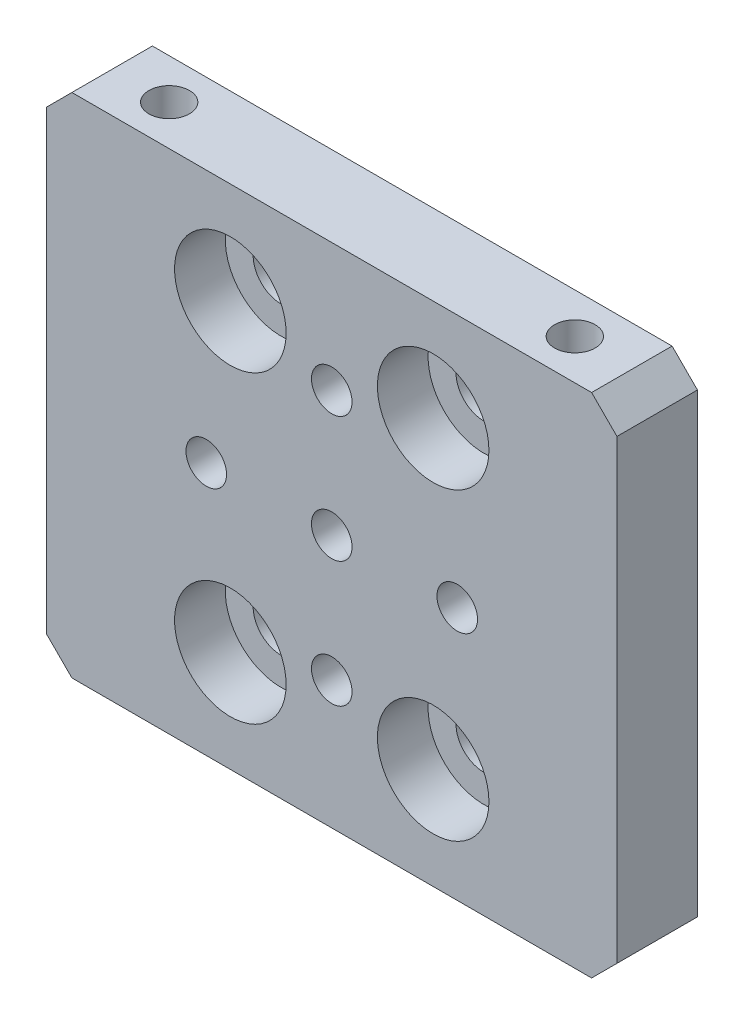
ISO-10303-21;
HEADER;
FILE_DESCRIPTION(('STEP AP214'),'2;1');
FILE_NAME('part.step','',(''),(''),'','','');
FILE_SCHEMA(('AUTOMOTIVE_DESIGN { 1 0 10303 214 1 1 1 1 }'));
ENDSEC;
DATA;
#1=APPLICATION_CONTEXT('core data for automotive mechanical design processes');
#2=APPLICATION_PROTOCOL_DEFINITION('international standard','automotive_design',2000,#1);
#3=PRODUCT_CONTEXT('',#1,'mechanical');
#4=PRODUCT('Part','Part','',(#3));
#5=PRODUCT_RELATED_PRODUCT_CATEGORY('part','',(#4));
#6=PRODUCT_DEFINITION_FORMATION('','',#4);
#7=PRODUCT_DEFINITION_CONTEXT('part definition',#1,'design');
#8=PRODUCT_DEFINITION('design','',#6,#7);
#9=PRODUCT_DEFINITION_SHAPE('','',#8);
#10=(LENGTH_UNIT() NAMED_UNIT(*) SI_UNIT(.MILLI.,.METRE.));
#11=(NAMED_UNIT(*) PLANE_ANGLE_UNIT() SI_UNIT($,.RADIAN.));
#12=(NAMED_UNIT(*) SI_UNIT($,.STERADIAN.) SOLID_ANGLE_UNIT());
#13=UNCERTAINTY_MEASURE_WITH_UNIT(LENGTH_MEASURE(1.E-05),#10,'distance_accuracy_value','');
#14=(GEOMETRIC_REPRESENTATION_CONTEXT(3) GLOBAL_UNCERTAINTY_ASSIGNED_CONTEXT((#13)) GLOBAL_UNIT_ASSIGNED_CONTEXT((#10,
#11,#12)) REPRESENTATION_CONTEXT('',''));
#15=CARTESIAN_POINT('',(0.,0.,0.));
#16=DIRECTION('',(0.,0.,1.));
#17=DIRECTION('',(1.,0.,0.));
#18=AXIS2_PLACEMENT_3D('',#15,#16,#17);
#19=CARTESIAN_POINT('',(11.25,10.,3.175));
#20=DIRECTION('',(-1.,0.,0.));
#21=DIRECTION('',(0.,0.,1.));
#22=AXIS2_PLACEMENT_3D('',#19,#20,#21);
#23=PLANE('',#22);
#24=DIRECTION('',(0.,1.,0.));
#25=VECTOR('',#24,1.);
#26=CARTESIAN_POINT('',(11.25,10.,3.175));
#27=LINE('',#26,#25);
#28=CARTESIAN_POINT('',(11.25,-9.,3.175));
#29=VERTEX_POINT('',#28);
#30=CARTESIAN_POINT('',(11.25,9.,3.175));
#31=VERTEX_POINT('',#30);
#32=EDGE_CURVE('E135',#29,#31,#27,.T.);
#33=ORIENTED_EDGE('',*,*,#32,.F.);
#34=DIRECTION('',(0.,0.,-1.));
#35=VECTOR('',#34,1.);
#36=CARTESIAN_POINT('',(11.25,-9.,3.175));
#37=LINE('',#36,#35);
#38=CARTESIAN_POINT('',(11.25,-9.,0.));
#39=VERTEX_POINT('',#38);
#40=EDGE_CURVE('E13',#29,#39,#37,.T.);
#41=ORIENTED_EDGE('',*,*,#40,.T.);
#42=DIRECTION('',(0.,1.,0.));
#43=VECTOR('',#42,1.);
#44=CARTESIAN_POINT('',(11.25,10.,0.));
#45=LINE('',#44,#43);
#46=CARTESIAN_POINT('',(11.25,9.,0.));
#47=VERTEX_POINT('',#46);
#48=EDGE_CURVE('E137',#39,#47,#45,.T.);
#49=ORIENTED_EDGE('',*,*,#48,.T.);
#50=DIRECTION('',(0.,0.,1.));
#51=VECTOR('',#50,1.);
#52=CARTESIAN_POINT('',(11.25,9.,3.175));
#53=LINE('',#52,#51);
#54=EDGE_CURVE('E48',#47,#31,#53,.T.);
#55=ORIENTED_EDGE('',*,*,#54,.T.);
#56=EDGE_LOOP('',(#33,#41,#49,#55));
#57=FACE_BOUND('',#56,.T.);
#58=ADVANCED_FACE('F39',(#57),#23,.F.);
#59=CARTESIAN_POINT('',(-11.25,10.,3.175));
#60=DIRECTION('',(0.,-1.,0.));
#61=DIRECTION('',(0.,0.,-1.));
#62=AXIS2_PLACEMENT_3D('',#59,#60,#61);
#63=PLANE('',#62);
#64=CARTESIAN_POINT('',(-8.,10.,1.5875));
#65=DIRECTION('',(0.,1.,0.));
#66=DIRECTION('',(0.,0.,1.));
#67=AXIS2_PLACEMENT_3D('',#64,#65,#66);
#68=CIRCLE('',#67,0.799999999999999);
#69=CARTESIAN_POINT('',(-8.,10.,2.3875));
#70=VERTEX_POINT('',#69);
#71=EDGE_CURVE('E239',#70,#70,#68,.T.);
#72=ORIENTED_EDGE('',*,*,#71,.F.);
#73=EDGE_LOOP('',(#72));
#74=FACE_BOUND('',#73,.T.);
#75=CARTESIAN_POINT('',(8.,10.,1.5875));
#76=DIRECTION('',(0.,1.,0.));
#77=DIRECTION('',(0.,0.,1.));
#78=AXIS2_PLACEMENT_3D('',#75,#76,#77);
#79=CIRCLE('',#78,0.799999999999999);
#80=CARTESIAN_POINT('',(8.,10.,2.3875));
#81=VERTEX_POINT('',#80);
#82=EDGE_CURVE('E233',#81,#81,#79,.T.);
#83=ORIENTED_EDGE('',*,*,#82,.F.);
#84=EDGE_LOOP('',(#83));
#85=FACE_BOUND('',#84,.T.);
#86=DIRECTION('',(-1.,0.,0.));
#87=VECTOR('',#86,1.);
#88=CARTESIAN_POINT('',(-11.25,10.,0.));
#89=LINE('',#88,#87);
#90=CARTESIAN_POINT('',(10.25,10.,0.));
#91=VERTEX_POINT('',#90);
#92=CARTESIAN_POINT('',(-10.25,10.,0.));
#93=VERTEX_POINT('',#92);
#94=EDGE_CURVE('E133',#91,#93,#89,.T.);
#95=ORIENTED_EDGE('',*,*,#94,.T.);
#96=DIRECTION('',(0.,0.,1.));
#97=VECTOR('',#96,1.);
#98=CARTESIAN_POINT('',(-10.25,10.,3.175));
#99=LINE('',#98,#97);
#100=CARTESIAN_POINT('',(-10.25,10.,3.175));
#101=VERTEX_POINT('',#100);
#102=EDGE_CURVE('E112',#93,#101,#99,.T.);
#103=ORIENTED_EDGE('',*,*,#102,.T.);
#104=DIRECTION('',(-1.,0.,0.));
#105=VECTOR('',#104,1.);
#106=CARTESIAN_POINT('',(-11.25,10.,3.175));
#107=LINE('',#106,#105);
#108=CARTESIAN_POINT('',(10.25,10.,3.175));
#109=VERTEX_POINT('',#108);
#110=EDGE_CURVE('E173',#109,#101,#107,.T.);
#111=ORIENTED_EDGE('',*,*,#110,.F.);
#112=DIRECTION('',(0.,0.,-1.));
#113=VECTOR('',#112,1.);
#114=CARTESIAN_POINT('',(10.25,10.,3.175));
#115=LINE('',#114,#113);
#116=EDGE_CURVE('E117',#109,#91,#115,.T.);
#117=ORIENTED_EDGE('',*,*,#116,.T.);
#118=EDGE_LOOP('',(#95,#103,#111,#117));
#119=FACE_BOUND('',#118,.T.);
#120=ADVANCED_FACE('F177',(#74,#85,#119),#63,.F.);
#121=CARTESIAN_POINT('',(-11.25,10.,3.175));
#122=DIRECTION('',(1.,0.,0.));
#123=DIRECTION('',(0.,0.,-1.));
#124=AXIS2_PLACEMENT_3D('',#121,#122,#123);
#125=PLANE('',#124);
#126=DIRECTION('',(0.,-1.,0.));
#127=VECTOR('',#126,1.);
#128=CARTESIAN_POINT('',(-11.25,10.,3.175));
#129=LINE('',#128,#127);
#130=CARTESIAN_POINT('',(-11.25,9.,3.175));
#131=VERTEX_POINT('',#130);
#132=CARTESIAN_POINT('',(-11.25,-9.,3.175));
#133=VERTEX_POINT('',#132);
#134=EDGE_CURVE('E126',#131,#133,#129,.T.);
#135=ORIENTED_EDGE('',*,*,#134,.F.);
#136=DIRECTION('',(0.,0.,-1.));
#137=VECTOR('',#136,1.);
#138=CARTESIAN_POINT('',(-11.25,9.,3.175));
#139=LINE('',#138,#137);
#140=CARTESIAN_POINT('',(-11.25,9.,0.));
#141=VERTEX_POINT('',#140);
#142=EDGE_CURVE('E111',#131,#141,#139,.T.);
#143=ORIENTED_EDGE('',*,*,#142,.T.);
#144=DIRECTION('',(0.,-1.,0.));
#145=VECTOR('',#144,1.);
#146=CARTESIAN_POINT('',(-11.25,10.,0.));
#147=LINE('',#146,#145);
#148=CARTESIAN_POINT('',(-11.25,-9.,0.));
#149=VERTEX_POINT('',#148);
#150=EDGE_CURVE('E124',#141,#149,#147,.T.);
#151=ORIENTED_EDGE('',*,*,#150,.T.);
#152=DIRECTION('',(0.,0.,1.));
#153=VECTOR('',#152,1.);
#154=CARTESIAN_POINT('',(-11.25,-9.,3.175));
#155=LINE('',#154,#153);
#156=EDGE_CURVE('E128',#149,#133,#155,.T.);
#157=ORIENTED_EDGE('',*,*,#156,.T.);
#158=EDGE_LOOP('',(#135,#143,#151,#157));
#159=FACE_BOUND('',#158,.T.);
#160=ADVANCED_FACE('F123',(#159),#125,.F.);
#161=CARTESIAN_POINT('',(-11.25,-10.,3.175));
#162=DIRECTION('',(0.,1.,0.));
#163=DIRECTION('',(0.,0.,1.));
#164=AXIS2_PLACEMENT_3D('',#161,#162,#163);
#165=PLANE('',#164);
#166=CARTESIAN_POINT('',(-8.,-10.,1.5875));
#167=DIRECTION('',(0.,1.,0.));
#168=DIRECTION('',(0.,0.,1.));
#169=AXIS2_PLACEMENT_3D('',#166,#167,#168);
#170=CIRCLE('',#169,0.799999999999995);
#171=CARTESIAN_POINT('',(-8.,-10.,2.3875));
#172=VERTEX_POINT('',#171);
#173=EDGE_CURVE('E236',#172,#172,#170,.T.);
#174=ORIENTED_EDGE('',*,*,#173,.T.);
#175=EDGE_LOOP('',(#174));
#176=FACE_BOUND('',#175,.T.);
#177=CARTESIAN_POINT('',(8.,-10.,1.5875));
#178=DIRECTION('',(0.,1.,0.));
#179=DIRECTION('',(0.,0.,1.));
#180=AXIS2_PLACEMENT_3D('',#177,#178,#179);
#181=CIRCLE('',#180,0.799999999999995);
#182=CARTESIAN_POINT('',(8.,-10.,2.38749999999999));
#183=VERTEX_POINT('',#182);
#184=EDGE_CURVE('E230',#183,#183,#181,.T.);
#185=ORIENTED_EDGE('',*,*,#184,.T.);
#186=EDGE_LOOP('',(#185));
#187=FACE_BOUND('',#186,.T.);
#188=DIRECTION('',(1.,0.,0.));
#189=VECTOR('',#188,1.);
#190=CARTESIAN_POINT('',(-11.25,-10.,3.175));
#191=LINE('',#190,#189);
#192=CARTESIAN_POINT('',(-10.25,-10.,3.175));
#193=VERTEX_POINT('',#192);
#194=CARTESIAN_POINT('',(10.25,-10.,3.175));
#195=VERTEX_POINT('',#194);
#196=EDGE_CURVE('E141',#193,#195,#191,.T.);
#197=ORIENTED_EDGE('',*,*,#196,.F.);
#198=DIRECTION('',(0.,0.,-1.));
#199=VECTOR('',#198,1.);
#200=CARTESIAN_POINT('',(-10.25,-10.,3.175));
#201=LINE('',#200,#199);
#202=CARTESIAN_POINT('',(-10.25,-10.,0.));
#203=VERTEX_POINT('',#202);
#204=EDGE_CURVE('E158',#193,#203,#201,.T.);
#205=ORIENTED_EDGE('',*,*,#204,.T.);
#206=DIRECTION('',(1.,0.,0.));
#207=VECTOR('',#206,1.);
#208=CARTESIAN_POINT('',(-11.25,-10.,0.));
#209=LINE('',#208,#207);
#210=CARTESIAN_POINT('',(10.25,-10.,0.));
#211=VERTEX_POINT('',#210);
#212=EDGE_CURVE('E132',#203,#211,#209,.T.);
#213=ORIENTED_EDGE('',*,*,#212,.T.);
#214=DIRECTION('',(0.,0.,1.));
#215=VECTOR('',#214,1.);
#216=CARTESIAN_POINT('',(10.25,-10.,3.175));
#217=LINE('',#216,#215);
#218=EDGE_CURVE('E55',#211,#195,#217,.T.);
#219=ORIENTED_EDGE('',*,*,#218,.T.);
#220=EDGE_LOOP('',(#197,#205,#213,#219));
#221=FACE_BOUND('',#220,.T.);
#222=ADVANCED_FACE('F277',(#176,#187,#221),#165,.F.);
#223=CARTESIAN_POINT('',(0.,0.,3.175));
#224=DIRECTION('',(0.,0.,1.));
#225=DIRECTION('',(1.,0.,0.));
#226=AXIS2_PLACEMENT_3D('',#223,#224,#225);
#227=PLANE('',#226);
#228=CARTESIAN_POINT('',(0.,0.,3.175));
#229=DIRECTION('',(0.,0.,1.));
#230=DIRECTION('',(1.,0.,0.));
#231=AXIS2_PLACEMENT_3D('',#228,#229,#230);
#232=CIRCLE('',#231,0.799999999999988);
#233=CARTESIAN_POINT('',(0.799999999999988,0.,3.175));
#234=VERTEX_POINT('',#233);
#235=EDGE_CURVE('E269',#234,#234,#232,.T.);
#236=ORIENTED_EDGE('',*,*,#235,.F.);
#237=EDGE_LOOP('',(#236));
#238=FACE_BOUND('',#237,.T.);
#239=CARTESIAN_POINT('',(-4.94974746830578,0.,3.175));
#240=DIRECTION('',(0.,0.,1.));
#241=DIRECTION('',(1.,0.,0.));
#242=AXIS2_PLACEMENT_3D('',#239,#240,#241);
#243=CIRCLE('',#242,0.799999999999988);
#244=CARTESIAN_POINT('',(-4.14974746830579,0.,3.175));
#245=VERTEX_POINT('',#244);
#246=EDGE_CURVE('E263',#245,#245,#243,.T.);
#247=ORIENTED_EDGE('',*,*,#246,.F.);
#248=EDGE_LOOP('',(#247));
#249=FACE_BOUND('',#248,.T.);
#250=CARTESIAN_POINT('',(0.,-4.94974746830581,3.175));
#251=DIRECTION('',(0.,0.,1.));
#252=DIRECTION('',(1.,0.,0.));
#253=AXIS2_PLACEMENT_3D('',#250,#251,#252);
#254=CIRCLE('',#253,0.799999999999988);
#255=CARTESIAN_POINT('',(0.800000000000067,-4.94974746830581,3.175));
#256=VERTEX_POINT('',#255);
#257=EDGE_CURVE('E257',#256,#256,#254,.T.);
#258=ORIENTED_EDGE('',*,*,#257,.F.);
#259=EDGE_LOOP('',(#258));
#260=FACE_BOUND('',#259,.T.);
#261=CARTESIAN_POINT('',(4.94974746830589,0.,3.175));
#262=DIRECTION('',(0.,0.,1.));
#263=DIRECTION('',(1.,0.,0.));
#264=AXIS2_PLACEMENT_3D('',#261,#262,#263);
#265=CIRCLE('',#264,0.799999999999988);
#266=CARTESIAN_POINT('',(5.74974746830587,0.,3.175));
#267=VERTEX_POINT('',#266);
#268=EDGE_CURVE('E251',#267,#267,#265,.T.);
#269=ORIENTED_EDGE('',*,*,#268,.F.);
#270=EDGE_LOOP('',(#269));
#271=FACE_BOUND('',#270,.T.);
#272=CARTESIAN_POINT('',(0.,4.94974746830586,3.175));
#273=DIRECTION('',(0.,0.,1.));
#274=DIRECTION('',(1.,0.,0.));
#275=AXIS2_PLACEMENT_3D('',#272,#273,#274);
#276=CIRCLE('',#275,0.799999999999988);
#277=CARTESIAN_POINT('',(0.800000000000014,4.94974746830586,3.175));
#278=VERTEX_POINT('',#277);
#279=EDGE_CURVE('E245',#278,#278,#276,.T.);
#280=ORIENTED_EDGE('',*,*,#279,.F.);
#281=EDGE_LOOP('',(#280));
#282=FACE_BOUND('',#281,.T.);
#283=CARTESIAN_POINT('',(4.,6.,3.175));
#284=DIRECTION('',(0.,0.,1.));
#285=DIRECTION('',(1.,0.,0.));
#286=AXIS2_PLACEMENT_3D('',#283,#284,#285);
#287=CIRCLE('',#286,2.2);
#288=CARTESIAN_POINT('',(6.2,6.,3.175));
#289=VERTEX_POINT('',#288);
#290=EDGE_CURVE('E227',#289,#289,#287,.T.);
#291=ORIENTED_EDGE('',*,*,#290,.F.);
#292=EDGE_LOOP('',(#291));
#293=FACE_BOUND('',#292,.T.);
#294=CARTESIAN_POINT('',(-4.,-6.,3.175));
#295=DIRECTION('',(0.,0.,1.));
#296=DIRECTION('',(1.,0.,0.));
#297=AXIS2_PLACEMENT_3D('',#294,#295,#296);
#298=CIRCLE('',#297,2.2);
#299=CARTESIAN_POINT('',(-1.8,-6.,3.175));
#300=VERTEX_POINT('',#299);
#301=EDGE_CURVE('E215',#300,#300,#298,.T.);
#302=ORIENTED_EDGE('',*,*,#301,.F.);
#303=EDGE_LOOP('',(#302));
#304=FACE_BOUND('',#303,.T.);
#305=CARTESIAN_POINT('',(-4.,6.,3.175));
#306=DIRECTION('',(0.,0.,1.));
#307=DIRECTION('',(1.,0.,0.));
#308=AXIS2_PLACEMENT_3D('',#305,#306,#307);
#309=CIRCLE('',#308,2.2);
#310=CARTESIAN_POINT('',(-1.8,6.,3.175));
#311=VERTEX_POINT('',#310);
#312=EDGE_CURVE('E203',#311,#311,#309,.T.);
#313=ORIENTED_EDGE('',*,*,#312,.F.);
#314=EDGE_LOOP('',(#313));
#315=FACE_BOUND('',#314,.T.);
#316=CARTESIAN_POINT('',(4.,-6.,3.175));
#317=DIRECTION('',(0.,0.,1.));
#318=DIRECTION('',(1.,0.,0.));
#319=AXIS2_PLACEMENT_3D('',#316,#317,#318);
#320=CIRCLE('',#319,2.2);
#321=CARTESIAN_POINT('',(6.2,-6.,3.175));
#322=VERTEX_POINT('',#321);
#323=EDGE_CURVE('E191',#322,#322,#320,.T.);
#324=ORIENTED_EDGE('',*,*,#323,.F.);
#325=EDGE_LOOP('',(#324));
#326=FACE_BOUND('',#325,.T.);
#327=ORIENTED_EDGE('',*,*,#110,.T.);
#328=DIRECTION('',(0.707106781186548,0.707106781186547,0.));
#329=VECTOR('',#328,1.);
#330=CARTESIAN_POINT('',(-10.125,10.125,3.175));
#331=LINE('',#330,#329);
#332=EDGE_CURVE('E155',#101,#131,#331,.F.);
#333=ORIENTED_EDGE('',*,*,#332,.T.);
#334=ORIENTED_EDGE('',*,*,#134,.T.);
#335=DIRECTION('',(-0.707106781186549,0.707106781186546,0.));
#336=VECTOR('',#335,1.);
#337=CARTESIAN_POINT('',(-10.125,-10.125,3.175));
#338=LINE('',#337,#336);
#339=EDGE_CURVE('E62',#133,#193,#338,.F.);
#340=ORIENTED_EDGE('',*,*,#339,.T.);
#341=ORIENTED_EDGE('',*,*,#196,.T.);
#342=DIRECTION('',(-0.707106781186549,-0.707106781186546,0.));
#343=VECTOR('',#342,1.);
#344=CARTESIAN_POINT('',(10.125,-10.125,3.175));
#345=LINE('',#344,#343);
#346=EDGE_CURVE('E152',#195,#29,#345,.F.);
#347=ORIENTED_EDGE('',*,*,#346,.T.);
#348=ORIENTED_EDGE('',*,*,#32,.T.);
#349=DIRECTION('',(0.707106781186548,-0.707106781186547,0.));
#350=VECTOR('',#349,1.);
#351=CARTESIAN_POINT('',(10.125,10.125,3.175));
#352=LINE('',#351,#350);
#353=EDGE_CURVE('E150',#31,#109,#352,.F.);
#354=ORIENTED_EDGE('',*,*,#353,.T.);
#355=EDGE_LOOP('',(#327,#333,#334,#340,#341,#347,#348,#354));
#356=FACE_BOUND('',#355,.T.);
#357=ADVANCED_FACE('F170',(#238,#249,#260,#271,#282,#293,#304,#315,#326,#356),#227,.T.);
#358=CARTESIAN_POINT('',(0.,0.,0.));
#359=DIRECTION('',(0.,0.,1.));
#360=DIRECTION('',(1.,0.,0.));
#361=AXIS2_PLACEMENT_3D('',#358,#359,#360);
#362=PLANE('',#361);
#363=CARTESIAN_POINT('',(0.,0.,0.));
#364=DIRECTION('',(0.,0.,1.));
#365=DIRECTION('',(1.,0.,0.));
#366=AXIS2_PLACEMENT_3D('',#363,#364,#365);
#367=CIRCLE('',#366,0.799999999999999);
#368=CARTESIAN_POINT('',(0.799999999999999,0.,0.));
#369=VERTEX_POINT('',#368);
#370=EDGE_CURVE('E266',#369,#369,#367,.T.);
#371=ORIENTED_EDGE('',*,*,#370,.T.);
#372=EDGE_LOOP('',(#371));
#373=FACE_BOUND('',#372,.T.);
#374=CARTESIAN_POINT('',(-4.94974746830578,0.,0.));
#375=DIRECTION('',(0.,0.,1.));
#376=DIRECTION('',(1.,0.,0.));
#377=AXIS2_PLACEMENT_3D('',#374,#375,#376);
#378=CIRCLE('',#377,0.799999999999999);
#379=CARTESIAN_POINT('',(-4.14974746830578,0.,0.));
#380=VERTEX_POINT('',#379);
#381=EDGE_CURVE('E260',#380,#380,#378,.T.);
#382=ORIENTED_EDGE('',*,*,#381,.T.);
#383=EDGE_LOOP('',(#382));
#384=FACE_BOUND('',#383,.T.);
#385=CARTESIAN_POINT('',(0.,-4.94974746830581,0.));
#386=DIRECTION('',(0.,0.,1.));
#387=DIRECTION('',(1.,0.,0.));
#388=AXIS2_PLACEMENT_3D('',#385,#386,#387);
#389=CIRCLE('',#388,0.799999999999999);
#390=CARTESIAN_POINT('',(0.800000000000078,-4.94974746830581,0.));
#391=VERTEX_POINT('',#390);
#392=EDGE_CURVE('E254',#391,#391,#389,.T.);
#393=ORIENTED_EDGE('',*,*,#392,.T.);
#394=EDGE_LOOP('',(#393));
#395=FACE_BOUND('',#394,.T.);
#396=CARTESIAN_POINT('',(4.94974746830589,0.,0.));
#397=DIRECTION('',(0.,0.,1.));
#398=DIRECTION('',(1.,0.,0.));
#399=AXIS2_PLACEMENT_3D('',#396,#397,#398);
#400=CIRCLE('',#399,0.799999999999999);
#401=CARTESIAN_POINT('',(5.74974746830588,0.,0.));
#402=VERTEX_POINT('',#401);
#403=EDGE_CURVE('E248',#402,#402,#400,.T.);
#404=ORIENTED_EDGE('',*,*,#403,.T.);
#405=EDGE_LOOP('',(#404));
#406=FACE_BOUND('',#405,.T.);
#407=CARTESIAN_POINT('',(0.,4.94974746830586,0.));
#408=DIRECTION('',(0.,0.,1.));
#409=DIRECTION('',(1.,0.,0.));
#410=AXIS2_PLACEMENT_3D('',#407,#408,#409);
#411=CIRCLE('',#410,0.799999999999999);
#412=CARTESIAN_POINT('',(0.800000000000025,4.94974746830586,0.));
#413=VERTEX_POINT('',#412);
#414=EDGE_CURVE('E242',#413,#413,#411,.T.);
#415=ORIENTED_EDGE('',*,*,#414,.T.);
#416=EDGE_LOOP('',(#415));
#417=FACE_BOUND('',#416,.T.);
#418=CARTESIAN_POINT('',(4.,6.,0.));
#419=DIRECTION('',(0.,0.,1.));
#420=DIRECTION('',(1.,0.,0.));
#421=AXIS2_PLACEMENT_3D('',#418,#419,#420);
#422=CIRCLE('',#421,1.1);
#423=CARTESIAN_POINT('',(5.1,6.,0.));
#424=VERTEX_POINT('',#423);
#425=EDGE_CURVE('E218',#424,#424,#422,.T.);
#426=ORIENTED_EDGE('',*,*,#425,.T.);
#427=EDGE_LOOP('',(#426));
#428=FACE_BOUND('',#427,.T.);
#429=CARTESIAN_POINT('',(-4.,-6.,0.));
#430=DIRECTION('',(0.,0.,1.));
#431=DIRECTION('',(1.,0.,0.));
#432=AXIS2_PLACEMENT_3D('',#429,#430,#431);
#433=CIRCLE('',#432,1.1);
#434=CARTESIAN_POINT('',(-2.9,-6.,0.));
#435=VERTEX_POINT('',#434);
#436=EDGE_CURVE('E206',#435,#435,#433,.T.);
#437=ORIENTED_EDGE('',*,*,#436,.T.);
#438=EDGE_LOOP('',(#437));
#439=FACE_BOUND('',#438,.T.);
#440=CARTESIAN_POINT('',(-4.,6.,0.));
#441=DIRECTION('',(0.,0.,1.));
#442=DIRECTION('',(1.,0.,0.));
#443=AXIS2_PLACEMENT_3D('',#440,#441,#442);
#444=CIRCLE('',#443,1.1);
#445=CARTESIAN_POINT('',(-2.9,6.,0.));
#446=VERTEX_POINT('',#445);
#447=EDGE_CURVE('E194',#446,#446,#444,.T.);
#448=ORIENTED_EDGE('',*,*,#447,.T.);
#449=EDGE_LOOP('',(#448));
#450=FACE_BOUND('',#449,.T.);
#451=CARTESIAN_POINT('',(4.,-6.,0.));
#452=DIRECTION('',(0.,0.,1.));
#453=DIRECTION('',(1.,0.,0.));
#454=AXIS2_PLACEMENT_3D('',#451,#452,#453);
#455=CIRCLE('',#454,1.1);
#456=CARTESIAN_POINT('',(5.1,-6.,0.));
#457=VERTEX_POINT('',#456);
#458=EDGE_CURVE('E178',#457,#457,#455,.T.);
#459=ORIENTED_EDGE('',*,*,#458,.T.);
#460=EDGE_LOOP('',(#459));
#461=FACE_BOUND('',#460,.T.);
#462=ORIENTED_EDGE('',*,*,#150,.F.);
#463=DIRECTION('',(-0.707106781186548,-0.707106781186547,0.));
#464=VECTOR('',#463,1.);
#465=CARTESIAN_POINT('',(-11.25,9.,0.));
#466=LINE('',#465,#464);
#467=EDGE_CURVE('E107',#141,#93,#466,.F.);
#468=ORIENTED_EDGE('',*,*,#467,.T.);
#469=ORIENTED_EDGE('',*,*,#94,.F.);
#470=DIRECTION('',(-0.707106781186548,0.707106781186547,0.));
#471=VECTOR('',#470,1.);
#472=CARTESIAN_POINT('',(10.25,10.,0.));
#473=LINE('',#472,#471);
#474=EDGE_CURVE('E127',#91,#47,#473,.F.);
#475=ORIENTED_EDGE('',*,*,#474,.T.);
#476=ORIENTED_EDGE('',*,*,#48,.F.);
#477=DIRECTION('',(0.707106781186549,0.707106781186546,0.));
#478=VECTOR('',#477,1.);
#479=CARTESIAN_POINT('',(11.25,-9.,0.));
#480=LINE('',#479,#478);
#481=EDGE_CURVE('E144',#39,#211,#480,.F.);
#482=ORIENTED_EDGE('',*,*,#481,.T.);
#483=ORIENTED_EDGE('',*,*,#212,.F.);
#484=DIRECTION('',(0.707106781186549,-0.707106781186546,0.));
#485=VECTOR('',#484,1.);
#486=CARTESIAN_POINT('',(-10.25,-10.,0.));
#487=LINE('',#486,#485);
#488=EDGE_CURVE('E118',#203,#149,#487,.F.);
#489=ORIENTED_EDGE('',*,*,#488,.T.);
#490=EDGE_LOOP('',(#462,#468,#469,#475,#476,#482,#483,#489));
#491=FACE_BOUND('',#490,.T.);
#492=ADVANCED_FACE('F130',(#373,#384,#395,#406,#417,#428,#439,#450,#461,#491),#362,.F.);
#493=CARTESIAN_POINT('',(4.,-6.,3.175));
#494=DIRECTION('',(0.,0.,1.));
#495=DIRECTION('',(1.,0.,0.));
#496=AXIS2_PLACEMENT_3D('',#493,#494,#495);
#497=CYLINDRICAL_SURFACE('',#496,1.1);
#498=ORIENTED_EDGE('',*,*,#458,.F.);
#499=EDGE_LOOP('',(#498));
#500=FACE_BOUND('',#499,.T.);
#501=CARTESIAN_POINT('',(4.,-6.,1.175));
#502=DIRECTION('',(0.,0.,1.));
#503=DIRECTION('',(1.,0.,0.));
#504=AXIS2_PLACEMENT_3D('',#501,#502,#503);
#505=CIRCLE('',#504,1.1);
#506=CARTESIAN_POINT('',(5.1,-6.,1.175));
#507=VERTEX_POINT('',#506);
#508=EDGE_CURVE('E180',#507,#507,#505,.T.);
#509=ORIENTED_EDGE('',*,*,#508,.T.);
#510=EDGE_LOOP('',(#509));
#511=FACE_BOUND('',#510,.T.);
#512=ADVANCED_FACE('F308',(#500,#511),#497,.F.);
#513=CARTESIAN_POINT('',(5.1,-6.,1.175));
#514=DIRECTION('',(0.,0.,-1.));
#515=DIRECTION('',(-1.,0.,0.));
#516=AXIS2_PLACEMENT_3D('',#513,#514,#515);
#517=PLANE('',#516);
#518=ORIENTED_EDGE('',*,*,#508,.F.);
#519=EDGE_LOOP('',(#518));
#520=FACE_BOUND('',#519,.T.);
#521=CARTESIAN_POINT('',(4.,-6.,1.175));
#522=DIRECTION('',(0.,0.,1.));
#523=DIRECTION('',(1.,0.,0.));
#524=AXIS2_PLACEMENT_3D('',#521,#522,#523);
#525=CIRCLE('',#524,2.2);
#526=CARTESIAN_POINT('',(6.2,-6.,1.175));
#527=VERTEX_POINT('',#526);
#528=EDGE_CURVE('E188',#527,#527,#525,.T.);
#529=ORIENTED_EDGE('',*,*,#528,.T.);
#530=EDGE_LOOP('',(#529));
#531=FACE_BOUND('',#530,.T.);
#532=ADVANCED_FACE('F298',(#520,#531),#517,.F.);
#533=CARTESIAN_POINT('',(4.,-6.,3.175));
#534=DIRECTION('',(0.,0.,1.));
#535=DIRECTION('',(1.,0.,0.));
#536=AXIS2_PLACEMENT_3D('',#533,#534,#535);
#537=CYLINDRICAL_SURFACE('',#536,2.2);
#538=ORIENTED_EDGE('',*,*,#528,.F.);
#539=EDGE_LOOP('',(#538));
#540=FACE_BOUND('',#539,.T.);
#541=ORIENTED_EDGE('',*,*,#323,.T.);
#542=EDGE_LOOP('',(#541));
#543=FACE_BOUND('',#542,.T.);
#544=ADVANCED_FACE('F295',(#540,#543),#537,.F.);
#545=CARTESIAN_POINT('',(-4.,6.,3.175));
#546=DIRECTION('',(0.,0.,1.));
#547=DIRECTION('',(1.,0.,0.));
#548=AXIS2_PLACEMENT_3D('',#545,#546,#547);
#549=CYLINDRICAL_SURFACE('',#548,1.1);
#550=ORIENTED_EDGE('',*,*,#447,.F.);
#551=EDGE_LOOP('',(#550));
#552=FACE_BOUND('',#551,.T.);
#553=CARTESIAN_POINT('',(-4.,6.,1.175));
#554=DIRECTION('',(0.,0.,1.));
#555=DIRECTION('',(1.,0.,0.));
#556=AXIS2_PLACEMENT_3D('',#553,#554,#555);
#557=CIRCLE('',#556,1.1);
#558=CARTESIAN_POINT('',(-2.9,6.,1.175));
#559=VERTEX_POINT('',#558);
#560=EDGE_CURVE('E197',#559,#559,#557,.T.);
#561=ORIENTED_EDGE('',*,*,#560,.T.);
#562=EDGE_LOOP('',(#561));
#563=FACE_BOUND('',#562,.T.);
#564=ADVANCED_FACE('F297',(#552,#563),#549,.F.);
#565=CARTESIAN_POINT('',(-2.9,6.,1.175));
#566=DIRECTION('',(0.,0.,-1.));
#567=DIRECTION('',(-1.,0.,0.));
#568=AXIS2_PLACEMENT_3D('',#565,#566,#567);
#569=PLANE('',#568);
#570=ORIENTED_EDGE('',*,*,#560,.F.);
#571=EDGE_LOOP('',(#570));
#572=FACE_BOUND('',#571,.T.);
#573=CARTESIAN_POINT('',(-4.,6.,1.175));
#574=DIRECTION('',(0.,0.,1.));
#575=DIRECTION('',(1.,0.,0.));
#576=AXIS2_PLACEMENT_3D('',#573,#574,#575);
#577=CIRCLE('',#576,2.2);
#578=CARTESIAN_POINT('',(-1.8,6.,1.175));
#579=VERTEX_POINT('',#578);
#580=EDGE_CURVE('E200',#579,#579,#577,.T.);
#581=ORIENTED_EDGE('',*,*,#580,.T.);
#582=EDGE_LOOP('',(#581));
#583=FACE_BOUND('',#582,.T.);
#584=ADVANCED_FACE('F305',(#572,#583),#569,.F.);
#585=CARTESIAN_POINT('',(-4.,6.,3.175));
#586=DIRECTION('',(0.,0.,1.));
#587=DIRECTION('',(1.,0.,0.));
#588=AXIS2_PLACEMENT_3D('',#585,#586,#587);
#589=CYLINDRICAL_SURFACE('',#588,2.2);
#590=ORIENTED_EDGE('',*,*,#580,.F.);
#591=EDGE_LOOP('',(#590));
#592=FACE_BOUND('',#591,.T.);
#593=ORIENTED_EDGE('',*,*,#312,.T.);
#594=EDGE_LOOP('',(#593));
#595=FACE_BOUND('',#594,.T.);
#596=ADVANCED_FACE('F531',(#592,#595),#589,.F.);
#597=CARTESIAN_POINT('',(-4.,-6.,3.175));
#598=DIRECTION('',(0.,0.,1.));
#599=DIRECTION('',(1.,0.,0.));
#600=AXIS2_PLACEMENT_3D('',#597,#598,#599);
#601=CYLINDRICAL_SURFACE('',#600,1.1);
#602=ORIENTED_EDGE('',*,*,#436,.F.);
#603=EDGE_LOOP('',(#602));
#604=FACE_BOUND('',#603,.T.);
#605=CARTESIAN_POINT('',(-4.,-6.,1.175));
#606=DIRECTION('',(0.,0.,1.));
#607=DIRECTION('',(1.,0.,0.));
#608=AXIS2_PLACEMENT_3D('',#605,#606,#607);
#609=CIRCLE('',#608,1.1);
#610=CARTESIAN_POINT('',(-2.9,-6.,1.175));
#611=VERTEX_POINT('',#610);
#612=EDGE_CURVE('E209',#611,#611,#609,.T.);
#613=ORIENTED_EDGE('',*,*,#612,.T.);
#614=EDGE_LOOP('',(#613));
#615=FACE_BOUND('',#614,.T.);
#616=ADVANCED_FACE('F521',(#604,#615),#601,.F.);
#617=CARTESIAN_POINT('',(-2.9,-6.,1.175));
#618=DIRECTION('',(0.,0.,-1.));
#619=DIRECTION('',(-1.,0.,0.));
#620=AXIS2_PLACEMENT_3D('',#617,#618,#619);
#621=PLANE('',#620);
#622=ORIENTED_EDGE('',*,*,#612,.F.);
#623=EDGE_LOOP('',(#622));
#624=FACE_BOUND('',#623,.T.);
#625=CARTESIAN_POINT('',(-4.,-6.,1.175));
#626=DIRECTION('',(0.,0.,1.));
#627=DIRECTION('',(1.,0.,0.));
#628=AXIS2_PLACEMENT_3D('',#625,#626,#627);
#629=CIRCLE('',#628,2.2);
#630=CARTESIAN_POINT('',(-1.8,-6.,1.175));
#631=VERTEX_POINT('',#630);
#632=EDGE_CURVE('E212',#631,#631,#629,.T.);
#633=ORIENTED_EDGE('',*,*,#632,.T.);
#634=EDGE_LOOP('',(#633));
#635=FACE_BOUND('',#634,.T.);
#636=ADVANCED_FACE('F511',(#624,#635),#621,.F.);
#637=CARTESIAN_POINT('',(-4.,-6.,3.175));
#638=DIRECTION('',(0.,0.,1.));
#639=DIRECTION('',(1.,0.,0.));
#640=AXIS2_PLACEMENT_3D('',#637,#638,#639);
#641=CYLINDRICAL_SURFACE('',#640,2.2);
#642=ORIENTED_EDGE('',*,*,#632,.F.);
#643=EDGE_LOOP('',(#642));
#644=FACE_BOUND('',#643,.T.);
#645=ORIENTED_EDGE('',*,*,#301,.T.);
#646=EDGE_LOOP('',(#645));
#647=FACE_BOUND('',#646,.T.);
#648=ADVANCED_FACE('F501',(#644,#647),#641,.F.);
#649=CARTESIAN_POINT('',(4.,6.,3.175));
#650=DIRECTION('',(0.,0.,1.));
#651=DIRECTION('',(1.,0.,0.));
#652=AXIS2_PLACEMENT_3D('',#649,#650,#651);
#653=CYLINDRICAL_SURFACE('',#652,1.1);
#654=ORIENTED_EDGE('',*,*,#425,.F.);
#655=EDGE_LOOP('',(#654));
#656=FACE_BOUND('',#655,.T.);
#657=CARTESIAN_POINT('',(4.,6.,1.175));
#658=DIRECTION('',(0.,0.,1.));
#659=DIRECTION('',(1.,0.,0.));
#660=AXIS2_PLACEMENT_3D('',#657,#658,#659);
#661=CIRCLE('',#660,1.1);
#662=CARTESIAN_POINT('',(5.1,6.,1.175));
#663=VERTEX_POINT('',#662);
#664=EDGE_CURVE('E221',#663,#663,#661,.T.);
#665=ORIENTED_EDGE('',*,*,#664,.T.);
#666=EDGE_LOOP('',(#665));
#667=FACE_BOUND('',#666,.T.);
#668=ADVANCED_FACE('F491',(#656,#667),#653,.F.);
#669=CARTESIAN_POINT('',(5.1,6.,1.175));
#670=DIRECTION('',(0.,0.,-1.));
#671=DIRECTION('',(-1.,0.,0.));
#672=AXIS2_PLACEMENT_3D('',#669,#670,#671);
#673=PLANE('',#672);
#674=ORIENTED_EDGE('',*,*,#664,.F.);
#675=EDGE_LOOP('',(#674));
#676=FACE_BOUND('',#675,.T.);
#677=CARTESIAN_POINT('',(4.,6.,1.175));
#678=DIRECTION('',(0.,0.,1.));
#679=DIRECTION('',(1.,0.,0.));
#680=AXIS2_PLACEMENT_3D('',#677,#678,#679);
#681=CIRCLE('',#680,2.2);
#682=CARTESIAN_POINT('',(6.2,6.,1.175));
#683=VERTEX_POINT('',#682);
#684=EDGE_CURVE('E224',#683,#683,#681,.T.);
#685=ORIENTED_EDGE('',*,*,#684,.T.);
#686=EDGE_LOOP('',(#685));
#687=FACE_BOUND('',#686,.T.);
#688=ADVANCED_FACE('F481',(#676,#687),#673,.F.);
#689=CARTESIAN_POINT('',(4.,6.,3.175));
#690=DIRECTION('',(0.,0.,1.));
#691=DIRECTION('',(1.,0.,0.));
#692=AXIS2_PLACEMENT_3D('',#689,#690,#691);
#693=CYLINDRICAL_SURFACE('',#692,2.2);
#694=ORIENTED_EDGE('',*,*,#684,.F.);
#695=EDGE_LOOP('',(#694));
#696=FACE_BOUND('',#695,.T.);
#697=ORIENTED_EDGE('',*,*,#290,.T.);
#698=EDGE_LOOP('',(#697));
#699=FACE_BOUND('',#698,.T.);
#700=ADVANCED_FACE('F471',(#696,#699),#693,.F.);
#701=CARTESIAN_POINT('',(8.,10.,1.5875));
#702=DIRECTION('',(0.,1.,0.));
#703=DIRECTION('',(0.,0.,1.));
#704=AXIS2_PLACEMENT_3D('',#701,#702,#703);
#705=CYLINDRICAL_SURFACE('',#704,0.799999999999997);
#706=ORIENTED_EDGE('',*,*,#184,.F.);
#707=EDGE_LOOP('',(#706));
#708=FACE_BOUND('',#707,.T.);
#709=ORIENTED_EDGE('',*,*,#82,.T.);
#710=EDGE_LOOP('',(#709));
#711=FACE_BOUND('',#710,.T.);
#712=ADVANCED_FACE('F461',(#708,#711),#705,.F.);
#713=CARTESIAN_POINT('',(-8.,10.,1.5875));
#714=DIRECTION('',(0.,1.,0.));
#715=DIRECTION('',(0.,0.,1.));
#716=AXIS2_PLACEMENT_3D('',#713,#714,#715);
#717=CYLINDRICAL_SURFACE('',#716,0.799999999999997);
#718=ORIENTED_EDGE('',*,*,#173,.F.);
#719=EDGE_LOOP('',(#718));
#720=FACE_BOUND('',#719,.T.);
#721=ORIENTED_EDGE('',*,*,#71,.T.);
#722=EDGE_LOOP('',(#721));
#723=FACE_BOUND('',#722,.T.);
#724=ADVANCED_FACE('F451',(#720,#723),#717,.F.);
#725=CARTESIAN_POINT('',(0.,4.94974746830586,3.175));
#726=DIRECTION('',(0.,0.,1.));
#727=DIRECTION('',(1.,0.,0.));
#728=AXIS2_PLACEMENT_3D('',#725,#726,#727);
#729=CYLINDRICAL_SURFACE('',#728,0.799999999999993);
#730=ORIENTED_EDGE('',*,*,#414,.F.);
#731=EDGE_LOOP('',(#730));
#732=FACE_BOUND('',#731,.T.);
#733=ORIENTED_EDGE('',*,*,#279,.T.);
#734=EDGE_LOOP('',(#733));
#735=FACE_BOUND('',#734,.T.);
#736=ADVANCED_FACE('F441',(#732,#735),#729,.F.);
#737=CARTESIAN_POINT('',(4.94974746830589,0.,3.175));
#738=DIRECTION('',(0.,0.,1.));
#739=DIRECTION('',(1.,0.,0.));
#740=AXIS2_PLACEMENT_3D('',#737,#738,#739);
#741=CYLINDRICAL_SURFACE('',#740,0.799999999999993);
#742=ORIENTED_EDGE('',*,*,#403,.F.);
#743=EDGE_LOOP('',(#742));
#744=FACE_BOUND('',#743,.T.);
#745=ORIENTED_EDGE('',*,*,#268,.T.);
#746=EDGE_LOOP('',(#745));
#747=FACE_BOUND('',#746,.T.);
#748=ADVANCED_FACE('F431',(#744,#747),#741,.F.);
#749=CARTESIAN_POINT('',(0.,-4.94974746830581,3.175));
#750=DIRECTION('',(0.,0.,1.));
#751=DIRECTION('',(1.,0.,0.));
#752=AXIS2_PLACEMENT_3D('',#749,#750,#751);
#753=CYLINDRICAL_SURFACE('',#752,0.799999999999993);
#754=ORIENTED_EDGE('',*,*,#392,.F.);
#755=EDGE_LOOP('',(#754));
#756=FACE_BOUND('',#755,.T.);
#757=ORIENTED_EDGE('',*,*,#257,.T.);
#758=EDGE_LOOP('',(#757));
#759=FACE_BOUND('',#758,.T.);
#760=ADVANCED_FACE('F421',(#756,#759),#753,.F.);
#761=CARTESIAN_POINT('',(-4.94974746830578,0.,3.175));
#762=DIRECTION('',(0.,0.,1.));
#763=DIRECTION('',(1.,0.,0.));
#764=AXIS2_PLACEMENT_3D('',#761,#762,#763);
#765=CYLINDRICAL_SURFACE('',#764,0.799999999999993);
#766=ORIENTED_EDGE('',*,*,#381,.F.);
#767=EDGE_LOOP('',(#766));
#768=FACE_BOUND('',#767,.T.);
#769=ORIENTED_EDGE('',*,*,#246,.T.);
#770=EDGE_LOOP('',(#769));
#771=FACE_BOUND('',#770,.T.);
#772=ADVANCED_FACE('F411',(#768,#771),#765,.F.);
#773=CARTESIAN_POINT('',(0.,0.,3.175));
#774=DIRECTION('',(0.,0.,1.));
#775=DIRECTION('',(1.,0.,0.));
#776=AXIS2_PLACEMENT_3D('',#773,#774,#775);
#777=CYLINDRICAL_SURFACE('',#776,0.799999999999993);
#778=ORIENTED_EDGE('',*,*,#370,.F.);
#779=EDGE_LOOP('',(#778));
#780=FACE_BOUND('',#779,.T.);
#781=ORIENTED_EDGE('',*,*,#235,.T.);
#782=EDGE_LOOP('',(#781));
#783=FACE_BOUND('',#782,.T.);
#784=ADVANCED_FACE('F273',(#780,#783),#777,.F.);
#785=CARTESIAN_POINT('',(-11.25,9.,3.175));
#786=DIRECTION('',(0.707106781186547,-0.707106781186548,0.));
#787=DIRECTION('',(0.,0.,-1.));
#788=AXIS2_PLACEMENT_3D('',#785,#786,#787);
#789=PLANE('',#788);
#790=ORIENTED_EDGE('',*,*,#332,.F.);
#791=ORIENTED_EDGE('',*,*,#102,.F.);
#792=ORIENTED_EDGE('',*,*,#467,.F.);
#793=ORIENTED_EDGE('',*,*,#142,.F.);
#794=EDGE_LOOP('',(#790,#791,#792,#793));
#795=FACE_BOUND('',#794,.T.);
#796=ADVANCED_FACE('F110',(#795),#789,.F.);
#797=CARTESIAN_POINT('',(-10.25,-10.,3.175));
#798=DIRECTION('',(0.707106781186546,0.707106781186549,0.));
#799=DIRECTION('',(0.,0.,-1.));
#800=AXIS2_PLACEMENT_3D('',#797,#798,#799);
#801=PLANE('',#800);
#802=ORIENTED_EDGE('',*,*,#339,.F.);
#803=ORIENTED_EDGE('',*,*,#156,.F.);
#804=ORIENTED_EDGE('',*,*,#488,.F.);
#805=ORIENTED_EDGE('',*,*,#204,.F.);
#806=EDGE_LOOP('',(#802,#803,#804,#805));
#807=FACE_BOUND('',#806,.T.);
#808=ADVANCED_FACE('F327',(#807),#801,.F.);
#809=CARTESIAN_POINT('',(11.25,-9.,3.175));
#810=DIRECTION('',(-0.707106781186546,0.707106781186549,0.));
#811=DIRECTION('',(0.,0.,-1.));
#812=AXIS2_PLACEMENT_3D('',#809,#810,#811);
#813=PLANE('',#812);
#814=ORIENTED_EDGE('',*,*,#346,.F.);
#815=ORIENTED_EDGE('',*,*,#218,.F.);
#816=ORIENTED_EDGE('',*,*,#481,.F.);
#817=ORIENTED_EDGE('',*,*,#40,.F.);
#818=EDGE_LOOP('',(#814,#815,#816,#817));
#819=FACE_BOUND('',#818,.T.);
#820=ADVANCED_FACE('F332',(#819),#813,.F.);
#821=CARTESIAN_POINT('',(10.25,10.,3.175));
#822=DIRECTION('',(-0.707106781186547,-0.707106781186548,0.));
#823=DIRECTION('',(0.,0.,-1.));
#824=AXIS2_PLACEMENT_3D('',#821,#822,#823);
#825=PLANE('',#824);
#826=ORIENTED_EDGE('',*,*,#353,.F.);
#827=ORIENTED_EDGE('',*,*,#54,.F.);
#828=ORIENTED_EDGE('',*,*,#474,.F.);
#829=ORIENTED_EDGE('',*,*,#116,.F.);
#830=EDGE_LOOP('',(#826,#827,#828,#829));
#831=FACE_BOUND('',#830,.T.);
#832=ADVANCED_FACE('F42',(#831),#825,.F.);
#833=CLOSED_SHELL('',(#58,#120,#160,#222,#357,#492,#512,#532,#544,#564,#584,#596,#616,#636,#648,
#668,#688,#700,#712,#724,#736,#748,#760,#772,#784,#796,#808,#820,#832));
#834=MANIFOLD_SOLID_BREP('B2',#833);
#835=ADVANCED_BREP_SHAPE_REPRESENTATION('',(#18,#834),#14);
#836=SHAPE_DEFINITION_REPRESENTATION(#9,#835);
ENDSEC;
END-ISO-10303-21;
